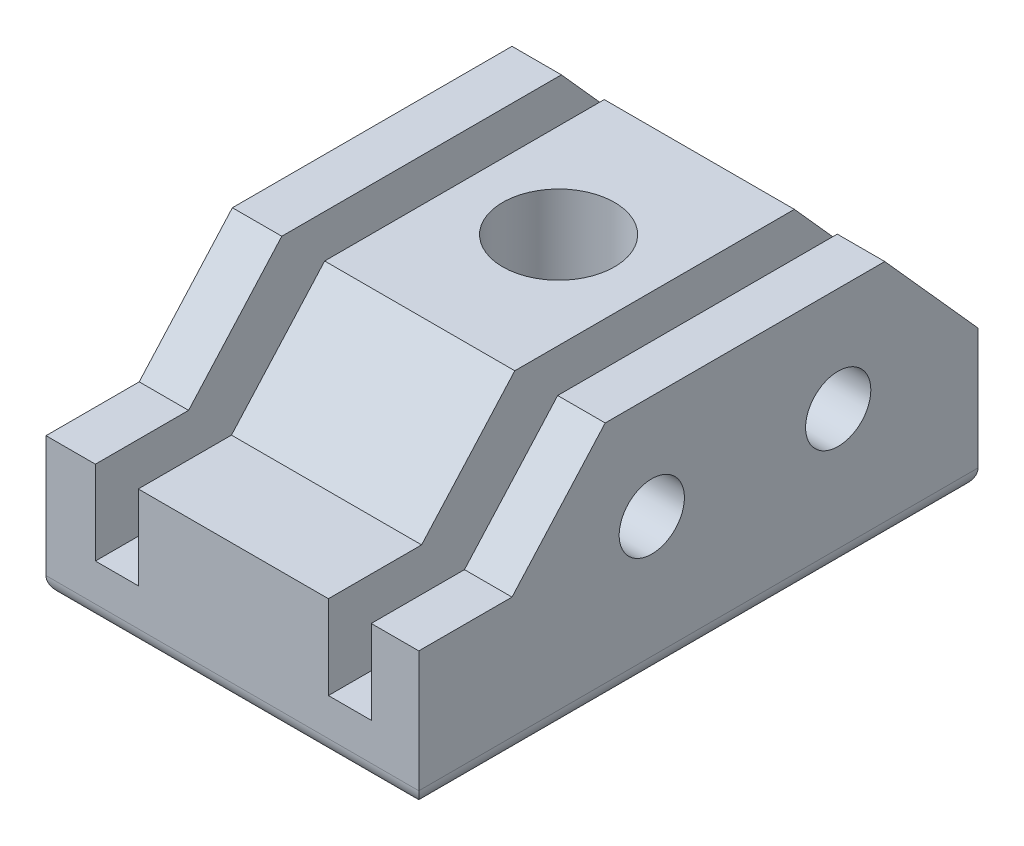
ISO-10303-21;
HEADER;
FILE_DESCRIPTION(('STEP AP214'),'2;1');
FILE_NAME('part.step','',(''),(''),'','','');
FILE_SCHEMA(('AUTOMOTIVE_DESIGN { 1 0 10303 214 1 1 1 1 }'));
ENDSEC;
DATA;
#1=APPLICATION_CONTEXT('core data for automotive mechanical design processes');
#2=APPLICATION_PROTOCOL_DEFINITION('international standard','automotive_design',2000,#1);
#3=PRODUCT_CONTEXT('',#1,'mechanical');
#4=PRODUCT('Part','Part','',(#3));
#5=PRODUCT_RELATED_PRODUCT_CATEGORY('part','',(#4));
#6=PRODUCT_DEFINITION_FORMATION('','',#4);
#7=PRODUCT_DEFINITION_CONTEXT('part definition',#1,'design');
#8=PRODUCT_DEFINITION('design','',#6,#7);
#9=PRODUCT_DEFINITION_SHAPE('','',#8);
#10=(LENGTH_UNIT() NAMED_UNIT(*) SI_UNIT(.MILLI.,.METRE.));
#11=(NAMED_UNIT(*) PLANE_ANGLE_UNIT() SI_UNIT($,.RADIAN.));
#12=(NAMED_UNIT(*) SI_UNIT($,.STERADIAN.) SOLID_ANGLE_UNIT());
#13=UNCERTAINTY_MEASURE_WITH_UNIT(LENGTH_MEASURE(1.E-05),#10,'distance_accuracy_value','');
#14=(GEOMETRIC_REPRESENTATION_CONTEXT(3) GLOBAL_UNCERTAINTY_ASSIGNED_CONTEXT((#13)) GLOBAL_UNIT_ASSIGNED_CONTEXT((#10,
#11,#12)) REPRESENTATION_CONTEXT('',''));
#15=CARTESIAN_POINT('',(0.,0.,0.));
#16=DIRECTION('',(0.,0.,1.));
#17=DIRECTION('',(1.,0.,0.));
#18=AXIS2_PLACEMENT_3D('',#15,#16,#17);
#19=CARTESIAN_POINT('',(-50.8,19.05,0.));
#20=DIRECTION('',(0.,0.666666666666667,0.74535599249993));
#21=DIRECTION('',(0.,-0.74535599249993,0.666666666666667));
#22=AXIS2_PLACEMENT_3D('',#19,#20,#21);
#23=PLANE('',#22);
#24=DIRECTION('',(0.,-0.74535599249993,0.666666666666667));
#25=VECTOR('',#24,1.);
#26=CARTESIAN_POINT('',(-44.069,19.05,0.));
#27=LINE('',#26,#25);
#28=CARTESIAN_POINT('',(-44.069,33.2490316571237,-12.7));
#29=VERTEX_POINT('',#28);
#30=CARTESIAN_POINT('',(-44.069,19.05,0.));
#31=VERTEX_POINT('',#30);
#32=EDGE_CURVE('E359',#29,#31,#27,.T.);
#33=ORIENTED_EDGE('',*,*,#32,.F.);
#34=DIRECTION('',(1.,0.,0.));
#35=VECTOR('',#34,1.);
#36=CARTESIAN_POINT('',(-50.8,33.2490316571237,-12.7));
#37=LINE('',#36,#35);
#38=CARTESIAN_POINT('',(-50.8,33.2490316571237,-12.7));
#39=VERTEX_POINT('',#38);
#40=EDGE_CURVE('E422',#39,#29,#37,.T.);
#41=ORIENTED_EDGE('',*,*,#40,.F.);
#42=DIRECTION('',(0.,-0.74535599249993,0.666666666666667));
#43=VECTOR('',#42,1.);
#44=CARTESIAN_POINT('',(-50.8,19.05,0.));
#45=LINE('',#44,#43);
#46=CARTESIAN_POINT('',(-50.8,19.05,0.));
#47=VERTEX_POINT('',#46);
#48=EDGE_CURVE('E403',#39,#47,#45,.T.);
#49=ORIENTED_EDGE('',*,*,#48,.T.);
#50=DIRECTION('',(1.,0.,0.));
#51=VECTOR('',#50,1.);
#52=CARTESIAN_POINT('',(-50.8,19.05,0.));
#53=LINE('',#52,#51);
#54=EDGE_CURVE('E415',#47,#31,#53,.T.);
#55=ORIENTED_EDGE('',*,*,#54,.T.);
#56=EDGE_LOOP('',(#33,#41,#49,#55));
#57=FACE_BOUND('',#56,.T.);
#58=ADVANCED_FACE('F53',(#57),#23,.T.);
#59=CARTESIAN_POINT('',(-50.8,33.2490316571237,-12.7));
#60=DIRECTION('',(0.,1.,0.));
#61=DIRECTION('',(0.,0.,1.));
#62=AXIS2_PLACEMENT_3D('',#59,#60,#61);
#63=PLANE('',#62);
#64=DIRECTION('',(0.,0.,-1.));
#65=VECTOR('',#64,1.);
#66=CARTESIAN_POINT('',(-44.069,33.2490316571237,0.));
#67=LINE('',#66,#65);
#68=CARTESIAN_POINT('',(-44.069,33.2490316571237,-50.8));
#69=VERTEX_POINT('',#68);
#70=EDGE_CURVE('E336',#29,#69,#67,.T.);
#71=ORIENTED_EDGE('',*,*,#70,.T.);
#72=DIRECTION('',(1.,0.,0.));
#73=VECTOR('',#72,1.);
#74=CARTESIAN_POINT('',(-50.8,33.2490316571237,-50.8));
#75=LINE('',#74,#73);
#76=CARTESIAN_POINT('',(-50.8,33.2490316571237,-50.8));
#77=VERTEX_POINT('',#76);
#78=EDGE_CURVE('E428',#77,#69,#75,.T.);
#79=ORIENTED_EDGE('',*,*,#78,.F.);
#80=DIRECTION('',(0.,0.,1.));
#81=VECTOR('',#80,1.);
#82=CARTESIAN_POINT('',(-50.8,33.2490316571237,-12.7));
#83=LINE('',#82,#81);
#84=EDGE_CURVE('E399',#77,#39,#83,.T.);
#85=ORIENTED_EDGE('',*,*,#84,.T.);
#86=ORIENTED_EDGE('',*,*,#40,.T.);
#87=EDGE_LOOP('',(#71,#79,#85,#86));
#88=FACE_BOUND('',#87,.T.);
#89=ADVANCED_FACE('F574',(#88),#63,.T.);
#90=CARTESIAN_POINT('',(-50.8,33.2490316571237,-50.8));
#91=DIRECTION('',(0.,0.666666666666666,-0.74535599249993));
#92=DIRECTION('',(0.,0.74535599249993,0.666666666666666));
#93=AXIS2_PLACEMENT_3D('',#90,#91,#92);
#94=PLANE('',#93);
#95=DIRECTION('',(0.,0.74535599249993,0.666666666666666));
#96=VECTOR('',#95,1.);
#97=CARTESIAN_POINT('',(-44.069,33.2490316571237,-50.8));
#98=LINE('',#97,#96);
#99=CARTESIAN_POINT('',(-44.069,19.05,-63.5));
#100=VERTEX_POINT('',#99);
#101=EDGE_CURVE('E356',#100,#69,#98,.T.);
#102=ORIENTED_EDGE('',*,*,#101,.F.);
#103=DIRECTION('',(1.,0.,0.));
#104=VECTOR('',#103,1.);
#105=CARTESIAN_POINT('',(-50.8,19.05,-63.5));
#106=LINE('',#105,#104);
#107=CARTESIAN_POINT('',(-50.8,19.05,-63.5));
#108=VERTEX_POINT('',#107);
#109=EDGE_CURVE('E434',#108,#100,#106,.T.);
#110=ORIENTED_EDGE('',*,*,#109,.F.);
#111=DIRECTION('',(0.,0.74535599249993,0.666666666666666));
#112=VECTOR('',#111,1.);
#113=CARTESIAN_POINT('',(-50.8,33.2490316571237,-50.8));
#114=LINE('',#113,#112);
#115=EDGE_CURVE('E395',#108,#77,#114,.T.);
#116=ORIENTED_EDGE('',*,*,#115,.T.);
#117=ORIENTED_EDGE('',*,*,#78,.T.);
#118=EDGE_LOOP('',(#102,#110,#116,#117));
#119=FACE_BOUND('',#118,.T.);
#120=ADVANCED_FACE('F582',(#119),#94,.T.);
#121=DIRECTION('',(0.,0.74535599249993,-0.666666666666667));
#122=VECTOR('',#121,1.);
#123=CARTESIAN_POINT('',(-38.227,19.05,0.));
#124=LINE('',#123,#122);
#125=CARTESIAN_POINT('',(-38.227,19.05,0.));
#126=VERTEX_POINT('',#125);
#127=CARTESIAN_POINT('',(-38.227,33.2490316571237,-12.7));
#128=VERTEX_POINT('',#127);
#129=EDGE_CURVE('E353',#126,#128,#124,.T.);
#130=ORIENTED_EDGE('',*,*,#129,.F.);
#131=CARTESIAN_POINT('',(-12.319,19.05,0.));
#132=VERTEX_POINT('',#131);
#133=EDGE_CURVE('E420',#126,#132,#53,.T.);
#134=ORIENTED_EDGE('',*,*,#133,.T.);
#135=DIRECTION('',(0.,-0.74535599249993,0.666666666666667));
#136=VECTOR('',#135,1.);
#137=CARTESIAN_POINT('',(-12.319,19.05,0.));
#138=LINE('',#137,#136);
#139=CARTESIAN_POINT('',(-12.319,33.2490316571237,-12.7));
#140=VERTEX_POINT('',#139);
#141=EDGE_CURVE('E390',#140,#132,#138,.T.);
#142=ORIENTED_EDGE('',*,*,#141,.F.);
#143=EDGE_CURVE('E426',#128,#140,#37,.T.);
#144=ORIENTED_EDGE('',*,*,#143,.F.);
#145=EDGE_LOOP('',(#130,#134,#142,#144));
#146=FACE_BOUND('',#145,.T.);
#147=ADVANCED_FACE('F577',(#146),#23,.T.);
#148=CARTESIAN_POINT('',(-25.4,33.2490316571237,-31.75));
#149=DIRECTION('',(0.,1.,0.));
#150=DIRECTION('',(0.,0.,1.));
#151=AXIS2_PLACEMENT_3D('',#148,#149,#150);
#152=CIRCLE('',#151,7.62);
#153=CARTESIAN_POINT('',(-25.4,33.2490316571237,-24.13));
#154=VERTEX_POINT('',#153);
#155=EDGE_CURVE('E495',#154,#154,#152,.T.);
#156=ORIENTED_EDGE('',*,*,#155,.F.);
#157=EDGE_LOOP('',(#156));
#158=FACE_BOUND('',#157,.T.);
#159=DIRECTION('',(0.,0.,-1.));
#160=VECTOR('',#159,1.);
#161=CARTESIAN_POINT('',(-38.227,33.2490316571237,0.));
#162=LINE('',#161,#160);
#163=CARTESIAN_POINT('',(-38.227,33.2490316571237,-50.8));
#164=VERTEX_POINT('',#163);
#165=EDGE_CURVE('E345',#128,#164,#162,.T.);
#166=ORIENTED_EDGE('',*,*,#165,.F.);
#167=ORIENTED_EDGE('',*,*,#143,.T.);
#168=DIRECTION('',(0.,0.,-1.));
#169=VECTOR('',#168,1.);
#170=CARTESIAN_POINT('',(-12.319,33.2490316571237,0.));
#171=LINE('',#170,#169);
#172=CARTESIAN_POINT('',(-12.319,33.2490316571237,-50.8));
#173=VERTEX_POINT('',#172);
#174=EDGE_CURVE('E373',#140,#173,#171,.T.);
#175=ORIENTED_EDGE('',*,*,#174,.T.);
#176=EDGE_CURVE('E432',#164,#173,#75,.T.);
#177=ORIENTED_EDGE('',*,*,#176,.F.);
#178=EDGE_LOOP('',(#166,#167,#175,#177));
#179=FACE_BOUND('',#178,.T.);
#180=ADVANCED_FACE('F585',(#158,#179),#63,.T.);
#181=DIRECTION('',(0.,-0.74535599249993,-0.666666666666666));
#182=VECTOR('',#181,1.);
#183=CARTESIAN_POINT('',(-38.227,33.2490316571237,-50.8));
#184=LINE('',#183,#182);
#185=CARTESIAN_POINT('',(-38.227,19.05,-63.5));
#186=VERTEX_POINT('',#185);
#187=EDGE_CURVE('E340',#164,#186,#184,.T.);
#188=ORIENTED_EDGE('',*,*,#187,.F.);
#189=ORIENTED_EDGE('',*,*,#176,.T.);
#190=DIRECTION('',(0.,0.74535599249993,0.666666666666666));
#191=VECTOR('',#190,1.);
#192=CARTESIAN_POINT('',(-12.319,33.2490316571237,-50.8));
#193=LINE('',#192,#191);
#194=CARTESIAN_POINT('',(-12.319,19.05,-63.5));
#195=VERTEX_POINT('',#194);
#196=EDGE_CURVE('E447',#195,#173,#193,.T.);
#197=ORIENTED_EDGE('',*,*,#196,.F.);
#198=EDGE_CURVE('E438',#186,#195,#106,.T.);
#199=ORIENTED_EDGE('',*,*,#198,.F.);
#200=EDGE_LOOP('',(#188,#189,#197,#199));
#201=FACE_BOUND('',#200,.T.);
#202=ADVANCED_FACE('F668',(#201),#94,.T.);
#203=CARTESIAN_POINT('',(-50.8,0.,-63.5));
#204=DIRECTION('',(0.,0.,-1.));
#205=DIRECTION('',(-1.,0.,0.));
#206=AXIS2_PLACEMENT_3D('',#203,#204,#205);
#207=PLANE('',#206);
#208=DIRECTION('',(0.,1.,0.));
#209=VECTOR('',#208,1.);
#210=CARTESIAN_POINT('',(0.,0.,-63.5));
#211=LINE('',#210,#209);
#212=CARTESIAN_POINT('',(0.,2.54,-63.5));
#213=VERTEX_POINT('',#212);
#214=CARTESIAN_POINT('',(0.,19.05,-63.5));
#215=VERTEX_POINT('',#214);
#216=EDGE_CURVE('E419',#213,#215,#211,.T.);
#217=ORIENTED_EDGE('',*,*,#216,.F.);
#218=DIRECTION('',(1.,0.,0.));
#219=VECTOR('',#218,1.);
#220=CARTESIAN_POINT('',(-50.8,2.54,-63.5));
#221=LINE('',#220,#219);
#222=CARTESIAN_POINT('',(-50.8,2.54,-63.5));
#223=VERTEX_POINT('',#222);
#224=EDGE_CURVE('E473',#213,#223,#221,.F.);
#225=ORIENTED_EDGE('',*,*,#224,.T.);
#226=DIRECTION('',(0.,1.,0.));
#227=VECTOR('',#226,1.);
#228=CARTESIAN_POINT('',(-50.8,0.,-63.5));
#229=LINE('',#228,#227);
#230=EDGE_CURVE('E439',#223,#108,#229,.T.);
#231=ORIENTED_EDGE('',*,*,#230,.T.);
#232=ORIENTED_EDGE('',*,*,#109,.T.);
#233=DIRECTION('',(0.,1.,0.));
#234=VECTOR('',#233,1.);
#235=CARTESIAN_POINT('',(-44.069,7.61999999999999,-63.5));
#236=LINE('',#235,#234);
#237=CARTESIAN_POINT('',(-44.069,7.61999999999999,-63.5));
#238=VERTEX_POINT('',#237);
#239=EDGE_CURVE('E329',#238,#100,#236,.T.);
#240=ORIENTED_EDGE('',*,*,#239,.F.);
#241=DIRECTION('',(-1.,0.,0.));
#242=VECTOR('',#241,1.);
#243=CARTESIAN_POINT('',(-38.227,7.61999999999999,-63.5));
#244=LINE('',#243,#242);
#245=CARTESIAN_POINT('',(-38.227,7.61999999999999,-63.5));
#246=VERTEX_POINT('',#245);
#247=EDGE_CURVE('E332',#246,#238,#244,.T.);
#248=ORIENTED_EDGE('',*,*,#247,.F.);
#249=DIRECTION('',(0.,-1.,0.));
#250=VECTOR('',#249,1.);
#251=CARTESIAN_POINT('',(-38.227,0.,-63.5));
#252=LINE('',#251,#250);
#253=EDGE_CURVE('E451',#186,#246,#252,.T.);
#254=ORIENTED_EDGE('',*,*,#253,.F.);
#255=ORIENTED_EDGE('',*,*,#198,.T.);
#256=DIRECTION('',(0.,1.,0.));
#257=VECTOR('',#256,1.);
#258=CARTESIAN_POINT('',(-12.319,7.61999999999999,-63.5));
#259=LINE('',#258,#257);
#260=CARTESIAN_POINT('',(-12.319,7.61999999999999,-63.5));
#261=VERTEX_POINT('',#260);
#262=EDGE_CURVE('E362',#261,#195,#259,.T.);
#263=ORIENTED_EDGE('',*,*,#262,.F.);
#264=DIRECTION('',(-1.,0.,0.));
#265=VECTOR('',#264,1.);
#266=CARTESIAN_POINT('',(-6.477,7.61999999999999,-63.5));
#267=LINE('',#266,#265);
#268=CARTESIAN_POINT('',(-6.477,7.61999999999999,-63.5));
#269=VERTEX_POINT('',#268);
#270=EDGE_CURVE('E369',#269,#261,#267,.T.);
#271=ORIENTED_EDGE('',*,*,#270,.F.);
#272=DIRECTION('',(0.,-1.,0.));
#273=VECTOR('',#272,1.);
#274=CARTESIAN_POINT('',(-6.477,7.61999999999999,-63.5));
#275=LINE('',#274,#273);
#276=CARTESIAN_POINT('',(-6.477,19.05,-63.5));
#277=VERTEX_POINT('',#276);
#278=EDGE_CURVE('E366',#277,#269,#275,.T.);
#279=ORIENTED_EDGE('',*,*,#278,.F.);
#280=EDGE_CURVE('E406',#277,#215,#106,.T.);
#281=ORIENTED_EDGE('',*,*,#280,.T.);
#282=EDGE_LOOP('',(#217,#225,#231,#232,#240,#248,#254,#255,#263,#271,#279,#281));
#283=FACE_BOUND('',#282,.T.);
#284=ADVANCED_FACE('F552',(#283),#207,.T.);
#285=CARTESIAN_POINT('',(-50.8,0.,0.));
#286=DIRECTION('',(0.,-1.,0.));
#287=DIRECTION('',(0.,0.,-1.));
#288=AXIS2_PLACEMENT_3D('',#285,#286,#287);
#289=PLANE('',#288);
#290=CARTESIAN_POINT('',(-30.4,0.,3.34999999999999));
#291=DIRECTION('',(0.,-1.,0.));
#292=DIRECTION('',(0.,0.,-1.));
#293=AXIS2_PLACEMENT_3D('',#290,#291,#292);
#294=CIRCLE('',#293,3.175);
#295=CARTESIAN_POINT('',(-30.4,0.,0.174999999999991));
#296=VERTEX_POINT('',#295);
#297=EDGE_CURVE('E515',#296,#296,#294,.T.);
#298=ORIENTED_EDGE('',*,*,#297,.F.);
#299=EDGE_LOOP('',(#298));
#300=FACE_BOUND('',#299,.T.);
#301=CARTESIAN_POINT('',(-20.4,0.,3.34999999999999));
#302=DIRECTION('',(0.,-1.,0.));
#303=DIRECTION('',(0.,0.,-1.));
#304=AXIS2_PLACEMENT_3D('',#301,#302,#303);
#305=CIRCLE('',#304,3.175);
#306=CARTESIAN_POINT('',(-20.4,0.,0.174999999999991));
#307=VERTEX_POINT('',#306);
#308=EDGE_CURVE('E523',#307,#307,#305,.T.);
#309=ORIENTED_EDGE('',*,*,#308,.F.);
#310=EDGE_LOOP('',(#309));
#311=FACE_BOUND('',#310,.T.);
#312=CARTESIAN_POINT('',(-20.4,0.,-46.15));
#313=DIRECTION('',(0.,-1.,0.));
#314=DIRECTION('',(0.,0.,-1.));
#315=AXIS2_PLACEMENT_3D('',#312,#313,#314);
#316=CIRCLE('',#315,3.175);
#317=CARTESIAN_POINT('',(-20.4,0.,-49.325));
#318=VERTEX_POINT('',#317);
#319=EDGE_CURVE('E531',#318,#318,#316,.T.);
#320=ORIENTED_EDGE('',*,*,#319,.F.);
#321=EDGE_LOOP('',(#320));
#322=FACE_BOUND('',#321,.T.);
#323=CARTESIAN_POINT('',(-30.4,0.,-46.15));
#324=DIRECTION('',(0.,-1.,0.));
#325=DIRECTION('',(0.,0.,-1.));
#326=AXIS2_PLACEMENT_3D('',#323,#324,#325);
#327=CIRCLE('',#326,3.175);
#328=CARTESIAN_POINT('',(-30.4,0.,-49.325));
#329=VERTEX_POINT('',#328);
#330=EDGE_CURVE('E507',#329,#329,#327,.T.);
#331=ORIENTED_EDGE('',*,*,#330,.F.);
#332=EDGE_LOOP('',(#331));
#333=FACE_BOUND('',#332,.T.);
#334=DIRECTION('',(0.,0.,-1.));
#335=VECTOR('',#334,1.);
#336=CARTESIAN_POINT('',(-48.26,0.,0.));
#337=LINE('',#336,#335);
#338=CARTESIAN_POINT('',(-48.26,0.,10.16));
#339=VERTEX_POINT('',#338);
#340=CARTESIAN_POINT('',(-48.26,0.,-60.96));
#341=VERTEX_POINT('',#340);
#342=EDGE_CURVE('E466',#339,#341,#337,.T.);
#343=ORIENTED_EDGE('',*,*,#342,.T.);
#344=DIRECTION('',(1.,0.,0.));
#345=VECTOR('',#344,1.);
#346=CARTESIAN_POINT('',(-50.8,0.,-60.96));
#347=LINE('',#346,#345);
#348=CARTESIAN_POINT('',(-2.54,0.,-60.96));
#349=VERTEX_POINT('',#348);
#350=EDGE_CURVE('E469',#341,#349,#347,.T.);
#351=ORIENTED_EDGE('',*,*,#350,.T.);
#352=DIRECTION('',(0.,0.,-1.));
#353=VECTOR('',#352,1.);
#354=CARTESIAN_POINT('',(-2.54,0.,12.7));
#355=LINE('',#354,#353);
#356=CARTESIAN_POINT('',(-2.54,0.,10.16));
#357=VERTEX_POINT('',#356);
#358=EDGE_CURVE('E454',#349,#357,#355,.F.);
#359=ORIENTED_EDGE('',*,*,#358,.T.);
#360=DIRECTION('',(1.,0.,0.));
#361=VECTOR('',#360,1.);
#362=CARTESIAN_POINT('',(-50.8,0.,10.16));
#363=LINE('',#362,#361);
#364=EDGE_CURVE('E463',#357,#339,#363,.F.);
#365=ORIENTED_EDGE('',*,*,#364,.T.);
#366=EDGE_LOOP('',(#343,#351,#359,#365));
#367=FACE_BOUND('',#366,.T.);
#368=CARTESIAN_POINT('',(-25.4,0.,-31.75));
#369=DIRECTION('',(0.,1.,0.));
#370=DIRECTION('',(0.,0.,1.));
#371=AXIS2_PLACEMENT_3D('',#368,#369,#370);
#372=CIRCLE('',#371,7.62);
#373=CARTESIAN_POINT('',(-25.4,0.,-24.13));
#374=VERTEX_POINT('',#373);
#375=EDGE_CURVE('E218',#374,#374,#372,.T.);
#376=ORIENTED_EDGE('',*,*,#375,.T.);
#377=EDGE_LOOP('',(#376));
#378=FACE_BOUND('',#377,.T.);
#379=ADVANCED_FACE('F548',(#300,#311,#322,#333,#367,#378),#289,.T.);
#380=CARTESIAN_POINT('',(-50.8,0.,0.));
#381=DIRECTION('',(-1.,0.,0.));
#382=DIRECTION('',(0.,0.,1.));
#383=AXIS2_PLACEMENT_3D('',#380,#381,#382);
#384=PLANE('',#383);
#385=CARTESIAN_POINT('',(-50.8,19.05,-19.05));
#386=DIRECTION('',(1.,0.,0.));
#387=DIRECTION('',(0.,0.,-1.));
#388=AXIS2_PLACEMENT_3D('',#385,#386,#387);
#389=CIRCLE('',#388,4.445);
#390=CARTESIAN_POINT('',(-50.8,19.05,-23.495));
#391=VERTEX_POINT('',#390);
#392=EDGE_CURVE('E288',#391,#391,#389,.T.);
#393=ORIENTED_EDGE('',*,*,#392,.T.);
#394=EDGE_LOOP('',(#393));
#395=FACE_BOUND('',#394,.T.);
#396=CARTESIAN_POINT('',(-50.8,19.05,-44.45));
#397=DIRECTION('',(1.,0.,0.));
#398=DIRECTION('',(0.,0.,-1.));
#399=AXIS2_PLACEMENT_3D('',#396,#397,#398);
#400=CIRCLE('',#399,4.44499999999999);
#401=CARTESIAN_POINT('',(-50.8,19.05,-48.895));
#402=VERTEX_POINT('',#401);
#403=EDGE_CURVE('E297',#402,#402,#400,.T.);
#404=ORIENTED_EDGE('',*,*,#403,.T.);
#405=EDGE_LOOP('',(#404));
#406=FACE_BOUND('',#405,.T.);
#407=ORIENTED_EDGE('',*,*,#230,.F.);
#408=DIRECTION('',(0.,0.,-1.));
#409=VECTOR('',#408,1.);
#410=CARTESIAN_POINT('',(-50.8,2.54,0.));
#411=LINE('',#410,#409);
#412=CARTESIAN_POINT('',(-50.8,2.54,12.7));
#413=VERTEX_POINT('',#412);
#414=EDGE_CURVE('E78',#223,#413,#411,.F.);
#415=ORIENTED_EDGE('',*,*,#414,.T.);
#416=DIRECTION('',(0.,-1.,0.));
#417=VECTOR('',#416,1.);
#418=CARTESIAN_POINT('',(-50.8,7.61999999999999,12.7));
#419=LINE('',#418,#417);
#420=CARTESIAN_POINT('',(-50.8,19.05,12.7));
#421=VERTEX_POINT('',#420);
#422=EDGE_CURVE('E267',#421,#413,#419,.T.);
#423=ORIENTED_EDGE('',*,*,#422,.F.);
#424=DIRECTION('',(0.,0.,-1.));
#425=VECTOR('',#424,1.);
#426=CARTESIAN_POINT('',(-50.8,19.05,12.7));
#427=LINE('',#426,#425);
#428=EDGE_CURVE('E270',#421,#47,#427,.T.);
#429=ORIENTED_EDGE('',*,*,#428,.T.);
#430=ORIENTED_EDGE('',*,*,#48,.F.);
#431=ORIENTED_EDGE('',*,*,#84,.F.);
#432=ORIENTED_EDGE('',*,*,#115,.F.);
#433=EDGE_LOOP('',(#407,#415,#423,#429,#430,#431,#432));
#434=FACE_BOUND('',#433,.T.);
#435=ADVANCED_FACE('F551',(#395,#406,#434),#384,.T.);
#436=CARTESIAN_POINT('',(0.,0.,0.));
#437=DIRECTION('',(-1.,0.,0.));
#438=DIRECTION('',(0.,0.,1.));
#439=AXIS2_PLACEMENT_3D('',#436,#437,#438);
#440=PLANE('',#439);
#441=CARTESIAN_POINT('',(0.,19.05,-19.05));
#442=DIRECTION('',(1.,0.,0.));
#443=DIRECTION('',(0.,0.,-1.));
#444=AXIS2_PLACEMENT_3D('',#441,#442,#443);
#445=CIRCLE('',#444,4.445);
#446=CARTESIAN_POINT('',(0.,19.05,-23.495));
#447=VERTEX_POINT('',#446);
#448=EDGE_CURVE('E293',#447,#447,#445,.T.);
#449=ORIENTED_EDGE('',*,*,#448,.F.);
#450=EDGE_LOOP('',(#449));
#451=FACE_BOUND('',#450,.T.);
#452=CARTESIAN_POINT('',(0.,19.05,-44.45));
#453=DIRECTION('',(1.,0.,0.));
#454=DIRECTION('',(0.,0.,-1.));
#455=AXIS2_PLACEMENT_3D('',#452,#453,#454);
#456=CIRCLE('',#455,4.44499999999999);
#457=CARTESIAN_POINT('',(0.,19.05,-48.895));
#458=VERTEX_POINT('',#457);
#459=EDGE_CURVE('E230',#458,#458,#456,.T.);
#460=ORIENTED_EDGE('',*,*,#459,.F.);
#461=EDGE_LOOP('',(#460));
#462=FACE_BOUND('',#461,.T.);
#463=DIRECTION('',(0.,1.,0.));
#464=VECTOR('',#463,1.);
#465=CARTESIAN_POINT('',(0.,0.,12.7));
#466=LINE('',#465,#464);
#467=CARTESIAN_POINT('',(0.,2.54,12.7));
#468=VERTEX_POINT('',#467);
#469=CARTESIAN_POINT('',(0.,19.05,12.7));
#470=VERTEX_POINT('',#469);
#471=EDGE_CURVE('E208',#468,#470,#466,.T.);
#472=ORIENTED_EDGE('',*,*,#471,.F.);
#473=DIRECTION('',(0.,0.,-1.));
#474=VECTOR('',#473,1.);
#475=CARTESIAN_POINT('',(0.,2.54,-63.5));
#476=LINE('',#475,#474);
#477=EDGE_CURVE('E13',#468,#213,#476,.T.);
#478=ORIENTED_EDGE('',*,*,#477,.T.);
#479=ORIENTED_EDGE('',*,*,#216,.T.);
#480=DIRECTION('',(0.,0.74535599249993,0.666666666666666));
#481=VECTOR('',#480,1.);
#482=CARTESIAN_POINT('',(0.,33.2490316571237,-50.8));
#483=LINE('',#482,#481);
#484=CARTESIAN_POINT('',(0.,33.2490316571237,-50.8));
#485=VERTEX_POINT('',#484);
#486=EDGE_CURVE('E394',#215,#485,#483,.T.);
#487=ORIENTED_EDGE('',*,*,#486,.T.);
#488=DIRECTION('',(0.,0.,1.));
#489=VECTOR('',#488,1.);
#490=CARTESIAN_POINT('',(0.,33.2490316571237,-12.7));
#491=LINE('',#490,#489);
#492=CARTESIAN_POINT('',(0.,33.2490316571237,-12.7));
#493=VERTEX_POINT('',#492);
#494=EDGE_CURVE('E410',#485,#493,#491,.T.);
#495=ORIENTED_EDGE('',*,*,#494,.T.);
#496=DIRECTION('',(0.,-0.74535599249993,0.666666666666667));
#497=VECTOR('',#496,1.);
#498=CARTESIAN_POINT('',(0.,19.05,0.));
#499=LINE('',#498,#497);
#500=CARTESIAN_POINT('',(0.,19.05,0.));
#501=VERTEX_POINT('',#500);
#502=EDGE_CURVE('E226',#493,#501,#499,.T.);
#503=ORIENTED_EDGE('',*,*,#502,.T.);
#504=DIRECTION('',(0.,0.,-1.));
#505=VECTOR('',#504,1.);
#506=CARTESIAN_POINT('',(0.,19.05,12.7));
#507=LINE('',#506,#505);
#508=EDGE_CURVE('E222',#470,#501,#507,.T.);
#509=ORIENTED_EDGE('',*,*,#508,.F.);
#510=EDGE_LOOP('',(#472,#478,#479,#487,#495,#503,#509));
#511=FACE_BOUND('',#510,.T.);
#512=ADVANCED_FACE('F223',(#451,#462,#511),#440,.F.);
#513=DIRECTION('',(0.,0.74535599249993,-0.666666666666667));
#514=VECTOR('',#513,1.);
#515=CARTESIAN_POINT('',(-6.477,19.05,0.));
#516=LINE('',#515,#514);
#517=CARTESIAN_POINT('',(-6.477,19.05,0.));
#518=VERTEX_POINT('',#517);
#519=CARTESIAN_POINT('',(-6.477,33.2490316571237,-12.7));
#520=VERTEX_POINT('',#519);
#521=EDGE_CURVE('E377',#518,#520,#516,.T.);
#522=ORIENTED_EDGE('',*,*,#521,.F.);
#523=EDGE_CURVE('E421',#518,#501,#53,.T.);
#524=ORIENTED_EDGE('',*,*,#523,.T.);
#525=ORIENTED_EDGE('',*,*,#502,.F.);
#526=EDGE_CURVE('E427',#520,#493,#37,.T.);
#527=ORIENTED_EDGE('',*,*,#526,.F.);
#528=EDGE_LOOP('',(#522,#524,#525,#527));
#529=FACE_BOUND('',#528,.T.);
#530=ADVANCED_FACE('F578',(#529),#23,.T.);
#531=DIRECTION('',(0.,0.,-1.));
#532=VECTOR('',#531,1.);
#533=CARTESIAN_POINT('',(-6.477,33.2490316571237,0.));
#534=LINE('',#533,#532);
#535=CARTESIAN_POINT('',(-6.477,33.2490316571237,-50.8));
#536=VERTEX_POINT('',#535);
#537=EDGE_CURVE('E382',#520,#536,#534,.T.);
#538=ORIENTED_EDGE('',*,*,#537,.F.);
#539=ORIENTED_EDGE('',*,*,#526,.T.);
#540=ORIENTED_EDGE('',*,*,#494,.F.);
#541=EDGE_CURVE('E433',#536,#485,#75,.T.);
#542=ORIENTED_EDGE('',*,*,#541,.F.);
#543=EDGE_LOOP('',(#538,#539,#540,#542));
#544=FACE_BOUND('',#543,.T.);
#545=ADVANCED_FACE('F586',(#544),#63,.T.);
#546=DIRECTION('',(0.,-0.74535599249993,-0.666666666666666));
#547=VECTOR('',#546,1.);
#548=CARTESIAN_POINT('',(-6.477,33.2490316571237,-50.8));
#549=LINE('',#548,#547);
#550=EDGE_CURVE('E442',#536,#277,#549,.T.);
#551=ORIENTED_EDGE('',*,*,#550,.F.);
#552=ORIENTED_EDGE('',*,*,#541,.T.);
#553=ORIENTED_EDGE('',*,*,#486,.F.);
#554=ORIENTED_EDGE('',*,*,#280,.F.);
#555=EDGE_LOOP('',(#551,#552,#553,#554));
#556=FACE_BOUND('',#555,.T.);
#557=ADVANCED_FACE('F597',(#556),#94,.T.);
#558=CARTESIAN_POINT('',(-12.319,7.61999999999999,0.));
#559=DIRECTION('',(-1.,0.,0.));
#560=DIRECTION('',(0.,0.,1.));
#561=AXIS2_PLACEMENT_3D('',#558,#559,#560);
#562=PLANE('',#561);
#563=CARTESIAN_POINT('',(-12.319,19.05,-19.05));
#564=DIRECTION('',(-1.,0.,0.));
#565=DIRECTION('',(0.,0.,1.));
#566=AXIS2_PLACEMENT_3D('',#563,#564,#565);
#567=CIRCLE('',#566,4.445);
#568=CARTESIAN_POINT('',(-12.319,19.05,-14.605));
#569=VERTEX_POINT('',#568);
#570=EDGE_CURVE('E325',#569,#569,#567,.T.);
#571=ORIENTED_EDGE('',*,*,#570,.T.);
#572=EDGE_LOOP('',(#571));
#573=FACE_BOUND('',#572,.T.);
#574=CARTESIAN_POINT('',(-12.319,19.05,-44.45));
#575=DIRECTION('',(-1.,0.,0.));
#576=DIRECTION('',(0.,0.,1.));
#577=AXIS2_PLACEMENT_3D('',#574,#575,#576);
#578=CIRCLE('',#577,4.44499999999999);
#579=CARTESIAN_POINT('',(-12.319,19.05,-40.005));
#580=VERTEX_POINT('',#579);
#581=EDGE_CURVE('E312',#580,#580,#578,.T.);
#582=ORIENTED_EDGE('',*,*,#581,.T.);
#583=EDGE_LOOP('',(#582));
#584=FACE_BOUND('',#583,.T.);
#585=ORIENTED_EDGE('',*,*,#141,.T.);
#586=DIRECTION('',(0.,0.,-1.));
#587=VECTOR('',#586,1.);
#588=CARTESIAN_POINT('',(-12.319,19.05,12.7));
#589=LINE('',#588,#587);
#590=CARTESIAN_POINT('',(-12.319,19.05,12.7));
#591=VERTEX_POINT('',#590);
#592=EDGE_CURVE('E282',#591,#132,#589,.T.);
#593=ORIENTED_EDGE('',*,*,#592,.F.);
#594=DIRECTION('',(0.,1.,0.));
#595=VECTOR('',#594,1.);
#596=CARTESIAN_POINT('',(-12.319,19.05,12.7));
#597=LINE('',#596,#595);
#598=CARTESIAN_POINT('',(-12.319,7.61999999999999,12.7));
#599=VERTEX_POINT('',#598);
#600=EDGE_CURVE('E247',#599,#591,#597,.T.);
#601=ORIENTED_EDGE('',*,*,#600,.F.);
#602=DIRECTION('',(0.,0.,-1.));
#603=VECTOR('',#602,1.);
#604=CARTESIAN_POINT('',(-12.319,7.61999999999999,0.));
#605=LINE('',#604,#603);
#606=EDGE_CURVE('E374',#599,#261,#605,.T.);
#607=ORIENTED_EDGE('',*,*,#606,.T.);
#608=ORIENTED_EDGE('',*,*,#262,.T.);
#609=ORIENTED_EDGE('',*,*,#196,.T.);
#610=ORIENTED_EDGE('',*,*,#174,.F.);
#611=EDGE_LOOP('',(#585,#593,#601,#607,#608,#609,#610));
#612=FACE_BOUND('',#611,.T.);
#613=ADVANCED_FACE('F613',(#573,#584,#612),#562,.F.);
#614=CARTESIAN_POINT('',(-6.477,7.61999999999999,0.));
#615=DIRECTION('',(0.,-1.,0.));
#616=DIRECTION('',(0.,0.,-1.));
#617=AXIS2_PLACEMENT_3D('',#614,#615,#616);
#618=PLANE('',#617);
#619=ORIENTED_EDGE('',*,*,#270,.T.);
#620=ORIENTED_EDGE('',*,*,#606,.F.);
#621=DIRECTION('',(-1.,0.,0.));
#622=VECTOR('',#621,1.);
#623=CARTESIAN_POINT('',(-6.477,7.61999999999999,12.7));
#624=LINE('',#623,#622);
#625=CARTESIAN_POINT('',(-6.477,7.61999999999999,12.7));
#626=VERTEX_POINT('',#625);
#627=EDGE_CURVE('E240',#626,#599,#624,.T.);
#628=ORIENTED_EDGE('',*,*,#627,.F.);
#629=DIRECTION('',(0.,0.,-1.));
#630=VECTOR('',#629,1.);
#631=CARTESIAN_POINT('',(-6.477,7.61999999999999,0.));
#632=LINE('',#631,#630);
#633=EDGE_CURVE('E378',#626,#269,#632,.T.);
#634=ORIENTED_EDGE('',*,*,#633,.T.);
#635=EDGE_LOOP('',(#619,#620,#628,#634));
#636=FACE_BOUND('',#635,.T.);
#637=ADVANCED_FACE('F609',(#636),#618,.F.);
#638=CARTESIAN_POINT('',(-6.477,7.61999999999999,0.));
#639=DIRECTION('',(1.,0.,0.));
#640=DIRECTION('',(0.,0.,-1.));
#641=AXIS2_PLACEMENT_3D('',#638,#639,#640);
#642=PLANE('',#641);
#643=CARTESIAN_POINT('',(-6.477,19.05,-19.05));
#644=DIRECTION('',(1.,0.,0.));
#645=DIRECTION('',(0.,0.,-1.));
#646=AXIS2_PLACEMENT_3D('',#643,#644,#645);
#647=CIRCLE('',#646,4.445);
#648=CARTESIAN_POINT('',(-6.477,19.05,-23.495));
#649=VERTEX_POINT('',#648);
#650=EDGE_CURVE('E321',#649,#649,#647,.T.);
#651=ORIENTED_EDGE('',*,*,#650,.T.);
#652=EDGE_LOOP('',(#651));
#653=FACE_BOUND('',#652,.T.);
#654=CARTESIAN_POINT('',(-6.477,19.05,-44.45));
#655=DIRECTION('',(1.,0.,0.));
#656=DIRECTION('',(0.,0.,-1.));
#657=AXIS2_PLACEMENT_3D('',#654,#655,#656);
#658=CIRCLE('',#657,4.44499999999999);
#659=CARTESIAN_POINT('',(-6.477,19.05,-48.895));
#660=VERTEX_POINT('',#659);
#661=EDGE_CURVE('E308',#660,#660,#658,.T.);
#662=ORIENTED_EDGE('',*,*,#661,.T.);
#663=EDGE_LOOP('',(#662));
#664=FACE_BOUND('',#663,.T.);
#665=ORIENTED_EDGE('',*,*,#521,.T.);
#666=ORIENTED_EDGE('',*,*,#537,.T.);
#667=ORIENTED_EDGE('',*,*,#550,.T.);
#668=ORIENTED_EDGE('',*,*,#278,.T.);
#669=ORIENTED_EDGE('',*,*,#633,.F.);
#670=DIRECTION('',(0.,-1.,0.));
#671=VECTOR('',#670,1.);
#672=CARTESIAN_POINT('',(-6.477,7.61999999999999,12.7));
#673=LINE('',#672,#671);
#674=CARTESIAN_POINT('',(-6.477,19.05,12.7));
#675=VERTEX_POINT('',#674);
#676=EDGE_CURVE('E237',#675,#626,#673,.T.);
#677=ORIENTED_EDGE('',*,*,#676,.F.);
#678=DIRECTION('',(0.,0.,-1.));
#679=VECTOR('',#678,1.);
#680=CARTESIAN_POINT('',(-6.477,19.05,12.7));
#681=LINE('',#680,#679);
#682=EDGE_CURVE('E231',#675,#518,#681,.T.);
#683=ORIENTED_EDGE('',*,*,#682,.T.);
#684=EDGE_LOOP('',(#665,#666,#667,#668,#669,#677,#683));
#685=FACE_BOUND('',#684,.T.);
#686=ADVANCED_FACE('F605',(#653,#664,#685),#642,.F.);
#687=CARTESIAN_POINT('',(-44.069,7.61999999999999,0.));
#688=DIRECTION('',(-1.,0.,0.));
#689=DIRECTION('',(0.,0.,1.));
#690=AXIS2_PLACEMENT_3D('',#687,#688,#689);
#691=PLANE('',#690);
#692=CARTESIAN_POINT('',(-44.069,19.05,-19.05));
#693=DIRECTION('',(-1.,0.,0.));
#694=DIRECTION('',(0.,0.,1.));
#695=AXIS2_PLACEMENT_3D('',#692,#693,#694);
#696=CIRCLE('',#695,4.445);
#697=CARTESIAN_POINT('',(-44.069,19.05,-14.605));
#698=VERTEX_POINT('',#697);
#699=EDGE_CURVE('E317',#698,#698,#696,.T.);
#700=ORIENTED_EDGE('',*,*,#699,.T.);
#701=EDGE_LOOP('',(#700));
#702=FACE_BOUND('',#701,.T.);
#703=CARTESIAN_POINT('',(-44.069,19.05,-44.45));
#704=DIRECTION('',(-1.,0.,0.));
#705=DIRECTION('',(0.,0.,1.));
#706=AXIS2_PLACEMENT_3D('',#703,#704,#705);
#707=CIRCLE('',#706,4.44499999999999);
#708=CARTESIAN_POINT('',(-44.069,19.05,-40.005));
#709=VERTEX_POINT('',#708);
#710=EDGE_CURVE('E304',#709,#709,#707,.T.);
#711=ORIENTED_EDGE('',*,*,#710,.T.);
#712=EDGE_LOOP('',(#711));
#713=FACE_BOUND('',#712,.T.);
#714=ORIENTED_EDGE('',*,*,#32,.T.);
#715=DIRECTION('',(0.,0.,-1.));
#716=VECTOR('',#715,1.);
#717=CARTESIAN_POINT('',(-44.069,19.05,12.7));
#718=LINE('',#717,#716);
#719=CARTESIAN_POINT('',(-44.069,19.05,12.7));
#720=VERTEX_POINT('',#719);
#721=EDGE_CURVE('E274',#720,#31,#718,.T.);
#722=ORIENTED_EDGE('',*,*,#721,.F.);
#723=DIRECTION('',(0.,1.,0.));
#724=VECTOR('',#723,1.);
#725=CARTESIAN_POINT('',(-44.069,19.05,12.7));
#726=LINE('',#725,#724);
#727=CARTESIAN_POINT('',(-44.069,7.61999999999999,12.7));
#728=VERTEX_POINT('',#727);
#729=EDGE_CURVE('E261',#728,#720,#726,.T.);
#730=ORIENTED_EDGE('',*,*,#729,.F.);
#731=DIRECTION('',(0.,0.,-1.));
#732=VECTOR('',#731,1.);
#733=CARTESIAN_POINT('',(-44.069,7.61999999999999,0.));
#734=LINE('',#733,#732);
#735=EDGE_CURVE('E337',#728,#238,#734,.T.);
#736=ORIENTED_EDGE('',*,*,#735,.T.);
#737=ORIENTED_EDGE('',*,*,#239,.T.);
#738=ORIENTED_EDGE('',*,*,#101,.T.);
#739=ORIENTED_EDGE('',*,*,#70,.F.);
#740=EDGE_LOOP('',(#714,#722,#730,#736,#737,#738,#739));
#741=FACE_BOUND('',#740,.T.);
#742=ADVANCED_FACE('F636',(#702,#713,#741),#691,.F.);
#743=CARTESIAN_POINT('',(-38.227,7.61999999999999,0.));
#744=DIRECTION('',(0.,-1.,0.));
#745=DIRECTION('',(0.,0.,-1.));
#746=AXIS2_PLACEMENT_3D('',#743,#744,#745);
#747=PLANE('',#746);
#748=ORIENTED_EDGE('',*,*,#247,.T.);
#749=ORIENTED_EDGE('',*,*,#735,.F.);
#750=DIRECTION('',(-1.,0.,0.));
#751=VECTOR('',#750,1.);
#752=CARTESIAN_POINT('',(-38.227,7.61999999999999,12.7));
#753=LINE('',#752,#751);
#754=CARTESIAN_POINT('',(-38.227,7.61999999999999,12.7));
#755=VERTEX_POINT('',#754);
#756=EDGE_CURVE('E257',#755,#728,#753,.T.);
#757=ORIENTED_EDGE('',*,*,#756,.F.);
#758=DIRECTION('',(0.,0.,-1.));
#759=VECTOR('',#758,1.);
#760=CARTESIAN_POINT('',(-38.227,7.61999999999999,0.));
#761=LINE('',#760,#759);
#762=EDGE_CURVE('E341',#755,#246,#761,.T.);
#763=ORIENTED_EDGE('',*,*,#762,.T.);
#764=EDGE_LOOP('',(#748,#749,#757,#763));
#765=FACE_BOUND('',#764,.T.);
#766=ADVANCED_FACE('F628',(#765),#747,.F.);
#767=CARTESIAN_POINT('',(-38.227,7.61999999999999,0.));
#768=DIRECTION('',(1.,0.,0.));
#769=DIRECTION('',(0.,0.,-1.));
#770=AXIS2_PLACEMENT_3D('',#767,#768,#769);
#771=PLANE('',#770);
#772=CARTESIAN_POINT('',(-38.227,19.05,-19.05));
#773=DIRECTION('',(1.,0.,0.));
#774=DIRECTION('',(0.,0.,-1.));
#775=AXIS2_PLACEMENT_3D('',#772,#773,#774);
#776=CIRCLE('',#775,4.445);
#777=CARTESIAN_POINT('',(-38.227,19.05,-23.495));
#778=VERTEX_POINT('',#777);
#779=EDGE_CURVE('E316',#778,#778,#776,.T.);
#780=ORIENTED_EDGE('',*,*,#779,.T.);
#781=EDGE_LOOP('',(#780));
#782=FACE_BOUND('',#781,.T.);
#783=CARTESIAN_POINT('',(-38.227,19.05,-44.45));
#784=DIRECTION('',(1.,0.,0.));
#785=DIRECTION('',(0.,0.,-1.));
#786=AXIS2_PLACEMENT_3D('',#783,#784,#785);
#787=CIRCLE('',#786,4.44499999999999);
#788=CARTESIAN_POINT('',(-38.227,19.05,-48.895));
#789=VERTEX_POINT('',#788);
#790=EDGE_CURVE('E292',#789,#789,#787,.T.);
#791=ORIENTED_EDGE('',*,*,#790,.T.);
#792=EDGE_LOOP('',(#791));
#793=FACE_BOUND('',#792,.T.);
#794=ORIENTED_EDGE('',*,*,#129,.T.);
#795=ORIENTED_EDGE('',*,*,#165,.T.);
#796=ORIENTED_EDGE('',*,*,#187,.T.);
#797=ORIENTED_EDGE('',*,*,#253,.T.);
#798=ORIENTED_EDGE('',*,*,#762,.F.);
#799=DIRECTION('',(0.,-1.,0.));
#800=VECTOR('',#799,1.);
#801=CARTESIAN_POINT('',(-38.227,7.61999999999999,12.7));
#802=LINE('',#801,#800);
#803=CARTESIAN_POINT('',(-38.227,19.05,12.7));
#804=VERTEX_POINT('',#803);
#805=EDGE_CURVE('E253',#804,#755,#802,.T.);
#806=ORIENTED_EDGE('',*,*,#805,.F.);
#807=DIRECTION('',(0.,0.,-1.));
#808=VECTOR('',#807,1.);
#809=CARTESIAN_POINT('',(-38.227,19.05,12.7));
#810=LINE('',#809,#808);
#811=EDGE_CURVE('E278',#804,#126,#810,.T.);
#812=ORIENTED_EDGE('',*,*,#811,.T.);
#813=EDGE_LOOP('',(#794,#795,#796,#797,#798,#806,#812));
#814=FACE_BOUND('',#813,.T.);
#815=ADVANCED_FACE('F624',(#782,#793,#814),#771,.F.);
#816=CARTESIAN_POINT('',(-50.8,19.05,-44.45));
#817=DIRECTION('',(1.,0.,0.));
#818=DIRECTION('',(0.,0.,-1.));
#819=AXIS2_PLACEMENT_3D('',#816,#817,#818);
#820=CYLINDRICAL_SURFACE('',#819,4.44499999999999);
#821=ORIENTED_EDGE('',*,*,#790,.F.);
#822=EDGE_LOOP('',(#821));
#823=FACE_BOUND('',#822,.T.);
#824=ORIENTED_EDGE('',*,*,#581,.F.);
#825=EDGE_LOOP('',(#824));
#826=FACE_BOUND('',#825,.T.);
#827=ADVANCED_FACE('F921',(#823,#826),#820,.F.);
#828=CARTESIAN_POINT('',(-50.8,19.05,-19.05));
#829=DIRECTION('',(1.,0.,0.));
#830=DIRECTION('',(0.,0.,-1.));
#831=AXIS2_PLACEMENT_3D('',#828,#829,#830);
#832=CYLINDRICAL_SURFACE('',#831,4.445);
#833=ORIENTED_EDGE('',*,*,#779,.F.);
#834=EDGE_LOOP('',(#833));
#835=FACE_BOUND('',#834,.T.);
#836=ORIENTED_EDGE('',*,*,#570,.F.);
#837=EDGE_LOOP('',(#836));
#838=FACE_BOUND('',#837,.T.);
#839=ADVANCED_FACE('F911',(#835,#838),#832,.F.);
#840=ORIENTED_EDGE('',*,*,#403,.F.);
#841=EDGE_LOOP('',(#840));
#842=FACE_BOUND('',#841,.T.);
#843=ORIENTED_EDGE('',*,*,#710,.F.);
#844=EDGE_LOOP('',(#843));
#845=FACE_BOUND('',#844,.T.);
#846=ADVANCED_FACE('F920',(#842,#845),#820,.F.);
#847=ORIENTED_EDGE('',*,*,#392,.F.);
#848=EDGE_LOOP('',(#847));
#849=FACE_BOUND('',#848,.T.);
#850=ORIENTED_EDGE('',*,*,#699,.F.);
#851=EDGE_LOOP('',(#850));
#852=FACE_BOUND('',#851,.T.);
#853=ADVANCED_FACE('F910',(#849,#852),#832,.F.);
#854=ORIENTED_EDGE('',*,*,#459,.T.);
#855=EDGE_LOOP('',(#854));
#856=FACE_BOUND('',#855,.T.);
#857=ORIENTED_EDGE('',*,*,#661,.F.);
#858=EDGE_LOOP('',(#857));
#859=FACE_BOUND('',#858,.T.);
#860=ADVANCED_FACE('F907',(#856,#859),#820,.F.);
#861=ORIENTED_EDGE('',*,*,#448,.T.);
#862=EDGE_LOOP('',(#861));
#863=FACE_BOUND('',#862,.T.);
#864=ORIENTED_EDGE('',*,*,#650,.F.);
#865=EDGE_LOOP('',(#864));
#866=FACE_BOUND('',#865,.T.);
#867=ADVANCED_FACE('F901',(#863,#866),#832,.F.);
#868=CARTESIAN_POINT('',(-6.477,19.05,12.7));
#869=DIRECTION('',(0.,-1.,0.));
#870=DIRECTION('',(0.,0.,-1.));
#871=AXIS2_PLACEMENT_3D('',#868,#869,#870);
#872=PLANE('',#871);
#873=ORIENTED_EDGE('',*,*,#523,.F.);
#874=ORIENTED_EDGE('',*,*,#682,.F.);
#875=DIRECTION('',(-1.,0.,0.));
#876=VECTOR('',#875,1.);
#877=CARTESIAN_POINT('',(-6.477,19.05,12.7));
#878=LINE('',#877,#876);
#879=EDGE_CURVE('E213',#470,#675,#878,.T.);
#880=ORIENTED_EDGE('',*,*,#879,.F.);
#881=ORIENTED_EDGE('',*,*,#508,.T.);
#882=EDGE_LOOP('',(#873,#874,#880,#881));
#883=FACE_BOUND('',#882,.T.);
#884=ADVANCED_FACE('F233',(#883),#872,.F.);
#885=CARTESIAN_POINT('',(-38.227,19.05,12.7));
#886=DIRECTION('',(0.,-1.,0.));
#887=DIRECTION('',(0.,0.,-1.));
#888=AXIS2_PLACEMENT_3D('',#885,#886,#887);
#889=PLANE('',#888);
#890=ORIENTED_EDGE('',*,*,#133,.F.);
#891=ORIENTED_EDGE('',*,*,#811,.F.);
#892=DIRECTION('',(-1.,0.,0.));
#893=VECTOR('',#892,1.);
#894=CARTESIAN_POINT('',(-38.227,19.05,12.7));
#895=LINE('',#894,#893);
#896=EDGE_CURVE('E250',#591,#804,#895,.T.);
#897=ORIENTED_EDGE('',*,*,#896,.F.);
#898=ORIENTED_EDGE('',*,*,#592,.T.);
#899=EDGE_LOOP('',(#890,#891,#897,#898));
#900=FACE_BOUND('',#899,.T.);
#901=ADVANCED_FACE('F622',(#900),#889,.F.);
#902=CARTESIAN_POINT('',(-50.8,19.05,12.7));
#903=DIRECTION('',(0.,-1.,0.));
#904=DIRECTION('',(0.,0.,-1.));
#905=AXIS2_PLACEMENT_3D('',#902,#903,#904);
#906=PLANE('',#905);
#907=ORIENTED_EDGE('',*,*,#54,.F.);
#908=ORIENTED_EDGE('',*,*,#428,.F.);
#909=DIRECTION('',(-1.,0.,0.));
#910=VECTOR('',#909,1.);
#911=CARTESIAN_POINT('',(-50.8,19.05,12.7));
#912=LINE('',#911,#910);
#913=EDGE_CURVE('E264',#720,#421,#912,.T.);
#914=ORIENTED_EDGE('',*,*,#913,.F.);
#915=ORIENTED_EDGE('',*,*,#721,.T.);
#916=EDGE_LOOP('',(#907,#908,#914,#915));
#917=FACE_BOUND('',#916,.T.);
#918=ADVANCED_FACE('F570',(#917),#906,.F.);
#919=CARTESIAN_POINT('',(0.,0.,12.7));
#920=DIRECTION('',(0.,0.,-1.));
#921=DIRECTION('',(-1.,0.,0.));
#922=AXIS2_PLACEMENT_3D('',#919,#920,#921);
#923=PLANE('',#922);
#924=ORIENTED_EDGE('',*,*,#422,.T.);
#925=DIRECTION('',(1.,0.,0.));
#926=VECTOR('',#925,1.);
#927=CARTESIAN_POINT('',(0.,2.54,12.7));
#928=LINE('',#927,#926);
#929=EDGE_CURVE('E63',#413,#468,#928,.T.);
#930=ORIENTED_EDGE('',*,*,#929,.T.);
#931=ORIENTED_EDGE('',*,*,#471,.T.);
#932=ORIENTED_EDGE('',*,*,#879,.T.);
#933=ORIENTED_EDGE('',*,*,#676,.T.);
#934=ORIENTED_EDGE('',*,*,#627,.T.);
#935=ORIENTED_EDGE('',*,*,#600,.T.);
#936=ORIENTED_EDGE('',*,*,#896,.T.);
#937=ORIENTED_EDGE('',*,*,#805,.T.);
#938=ORIENTED_EDGE('',*,*,#756,.T.);
#939=ORIENTED_EDGE('',*,*,#729,.T.);
#940=ORIENTED_EDGE('',*,*,#913,.T.);
#941=EDGE_LOOP('',(#924,#930,#931,#932,#933,#934,#935,#936,#937,#938,#939,#940));
#942=FACE_BOUND('',#941,.T.);
#943=ADVANCED_FACE('F210',(#942),#923,.F.);
#944=CARTESIAN_POINT('',(-25.4,0.,-31.75));
#945=DIRECTION('',(0.,1.,0.));
#946=DIRECTION('',(0.,0.,1.));
#947=AXIS2_PLACEMENT_3D('',#944,#945,#946);
#948=CYLINDRICAL_SURFACE('',#947,7.62);
#949=ORIENTED_EDGE('',*,*,#375,.F.);
#950=EDGE_LOOP('',(#949));
#951=FACE_BOUND('',#950,.T.);
#952=ORIENTED_EDGE('',*,*,#155,.T.);
#953=EDGE_LOOP('',(#952));
#954=FACE_BOUND('',#953,.T.);
#955=ADVANCED_FACE('F561',(#951,#954),#948,.F.);
#956=CARTESIAN_POINT('',(0.,2.54,10.16));
#957=DIRECTION('',(-1.,0.,0.));
#958=DIRECTION('',(0.,0.,1.));
#959=AXIS2_PLACEMENT_3D('',#956,#957,#958);
#960=CYLINDRICAL_SURFACE('',#959,2.54);
#961=CARTESIAN_POINT('',(-2.54,2.54,10.16));
#962=DIRECTION('',(-0.707106781186547,0.,0.707106781186547));
#963=DIRECTION('',(0.707106781186547,0.,0.707106781186547));
#964=AXIS2_PLACEMENT_3D('',#961,#962,#963);
#965=ELLIPSE('',#964,3.59210244842766,2.54);
#966=EDGE_CURVE('E487',#468,#357,#965,.F.);
#967=ORIENTED_EDGE('',*,*,#966,.F.);
#968=ORIENTED_EDGE('',*,*,#929,.F.);
#969=CARTESIAN_POINT('',(-48.26,2.54,10.16));
#970=DIRECTION('',(-0.707106781186547,0.,-0.707106781186547));
#971=DIRECTION('',(-0.707106781186547,0.,0.707106781186547));
#972=AXIS2_PLACEMENT_3D('',#969,#970,#971);
#973=ELLIPSE('',#972,3.59210244842766,2.54);
#974=EDGE_CURVE('E57',#339,#413,#973,.T.);
#975=ORIENTED_EDGE('',*,*,#974,.F.);
#976=ORIENTED_EDGE('',*,*,#364,.F.);
#977=EDGE_LOOP('',(#967,#968,#975,#976));
#978=FACE_BOUND('',#977,.T.);
#979=ADVANCED_FACE('F55',(#978),#960,.T.);
#980=CARTESIAN_POINT('',(-48.26,2.54,0.));
#981=DIRECTION('',(0.,0.,-1.));
#982=DIRECTION('',(-1.,0.,0.));
#983=AXIS2_PLACEMENT_3D('',#980,#981,#982);
#984=CYLINDRICAL_SURFACE('',#983,2.54);
#985=ORIENTED_EDGE('',*,*,#974,.T.);
#986=ORIENTED_EDGE('',*,*,#414,.F.);
#987=CARTESIAN_POINT('',(-48.26,2.54,-60.96));
#988=DIRECTION('',(0.707106781186547,0.,-0.707106781186547));
#989=DIRECTION('',(-0.707106781186547,0.,-0.707106781186547));
#990=AXIS2_PLACEMENT_3D('',#987,#988,#989);
#991=ELLIPSE('',#990,3.59210244842766,2.54);
#992=EDGE_CURVE('E484',#341,#223,#991,.T.);
#993=ORIENTED_EDGE('',*,*,#992,.F.);
#994=ORIENTED_EDGE('',*,*,#342,.F.);
#995=EDGE_LOOP('',(#985,#986,#993,#994));
#996=FACE_BOUND('',#995,.T.);
#997=ADVANCED_FACE('F568',(#996),#984,.T.);
#998=CARTESIAN_POINT('',(-2.54,2.54,0.));
#999=DIRECTION('',(0.,0.,1.));
#1000=DIRECTION('',(1.,0.,0.));
#1001=AXIS2_PLACEMENT_3D('',#998,#999,#1000);
#1002=CYLINDRICAL_SURFACE('',#1001,2.54);
#1003=ORIENTED_EDGE('',*,*,#966,.T.);
#1004=ORIENTED_EDGE('',*,*,#358,.F.);
#1005=CARTESIAN_POINT('',(-2.54,2.54,-60.96));
#1006=DIRECTION('',(0.707106781186547,0.,0.707106781186547));
#1007=DIRECTION('',(-0.707106781186547,0.,0.707106781186547));
#1008=AXIS2_PLACEMENT_3D('',#1005,#1006,#1007);
#1009=ELLIPSE('',#1008,3.59210244842766,2.54);
#1010=EDGE_CURVE('E481',#213,#349,#1009,.F.);
#1011=ORIENTED_EDGE('',*,*,#1010,.F.);
#1012=ORIENTED_EDGE('',*,*,#477,.F.);
#1013=EDGE_LOOP('',(#1003,#1004,#1011,#1012));
#1014=FACE_BOUND('',#1013,.T.);
#1015=ADVANCED_FACE('F649',(#1014),#1002,.T.);
#1016=CARTESIAN_POINT('',(-50.8,2.54,-60.96));
#1017=DIRECTION('',(1.,0.,0.));
#1018=DIRECTION('',(0.,0.,-1.));
#1019=AXIS2_PLACEMENT_3D('',#1016,#1017,#1018);
#1020=CYLINDRICAL_SURFACE('',#1019,2.54);
#1021=ORIENTED_EDGE('',*,*,#992,.T.);
#1022=ORIENTED_EDGE('',*,*,#224,.F.);
#1023=ORIENTED_EDGE('',*,*,#1010,.T.);
#1024=ORIENTED_EDGE('',*,*,#350,.F.);
#1025=EDGE_LOOP('',(#1021,#1022,#1023,#1024));
#1026=FACE_BOUND('',#1025,.T.);
#1027=ADVANCED_FACE('F656',(#1026),#1020,.T.);
#1028=CARTESIAN_POINT('',(-30.4,10.,-46.15));
#1029=DIRECTION('',(0.,-1.,0.));
#1030=DIRECTION('',(0.,0.,-1.));
#1031=AXIS2_PLACEMENT_3D('',#1028,#1029,#1030);
#1032=CYLINDRICAL_SURFACE('',#1031,3.175);
#1033=CARTESIAN_POINT('',(-30.4,10.,-46.15));
#1034=DIRECTION('',(0.,-1.,0.));
#1035=DIRECTION('',(0.,0.,-1.));
#1036=AXIS2_PLACEMENT_3D('',#1033,#1034,#1035);
#1037=CIRCLE('',#1036,3.175);
#1038=CARTESIAN_POINT('',(-30.4,10.,-49.325));
#1039=VERTEX_POINT('',#1038);
#1040=EDGE_CURVE('E485',#1039,#1039,#1037,.T.);
#1041=ORIENTED_EDGE('',*,*,#1040,.F.);
#1042=EDGE_LOOP('',(#1041));
#1043=FACE_BOUND('',#1042,.T.);
#1044=ORIENTED_EDGE('',*,*,#330,.T.);
#1045=EDGE_LOOP('',(#1044));
#1046=FACE_BOUND('',#1045,.T.);
#1047=ADVANCED_FACE('F665',(#1043,#1046),#1032,.F.);
#1048=CARTESIAN_POINT('',(-30.4,10.,-46.15));
#1049=DIRECTION('',(0.,-1.,0.));
#1050=DIRECTION('',(0.,0.,-1.));
#1051=AXIS2_PLACEMENT_3D('',#1048,#1049,#1050);
#1052=PLANE('',#1051);
#1053=ORIENTED_EDGE('',*,*,#1040,.T.);
#1054=EDGE_LOOP('',(#1053));
#1055=FACE_BOUND('',#1054,.T.);
#1056=ADVANCED_FACE('F544',(#1055),#1052,.T.);
#1057=CARTESIAN_POINT('',(-20.4,10.,-46.15));
#1058=DIRECTION('',(0.,-1.,0.));
#1059=DIRECTION('',(0.,0.,-1.));
#1060=AXIS2_PLACEMENT_3D('',#1057,#1058,#1059);
#1061=CYLINDRICAL_SURFACE('',#1060,3.175);
#1062=CARTESIAN_POINT('',(-20.4,10.,-46.15));
#1063=DIRECTION('',(0.,-1.,0.));
#1064=DIRECTION('',(0.,0.,-1.));
#1065=AXIS2_PLACEMENT_3D('',#1062,#1063,#1064);
#1066=CIRCLE('',#1065,3.175);
#1067=CARTESIAN_POINT('',(-20.4,10.,-49.325));
#1068=VERTEX_POINT('',#1067);
#1069=EDGE_CURVE('E511',#1068,#1068,#1066,.T.);
#1070=ORIENTED_EDGE('',*,*,#1069,.F.);
#1071=EDGE_LOOP('',(#1070));
#1072=FACE_BOUND('',#1071,.T.);
#1073=ORIENTED_EDGE('',*,*,#319,.T.);
#1074=EDGE_LOOP('',(#1073));
#1075=FACE_BOUND('',#1074,.T.);
#1076=ADVANCED_FACE('F541',(#1072,#1075),#1061,.F.);
#1077=CARTESIAN_POINT('',(-20.4,10.,-46.15));
#1078=DIRECTION('',(0.,-1.,0.));
#1079=DIRECTION('',(0.,0.,-1.));
#1080=AXIS2_PLACEMENT_3D('',#1077,#1078,#1079);
#1081=PLANE('',#1080);
#1082=ORIENTED_EDGE('',*,*,#1069,.T.);
#1083=EDGE_LOOP('',(#1082));
#1084=FACE_BOUND('',#1083,.T.);
#1085=ADVANCED_FACE('F539',(#1084),#1081,.T.);
#1086=CARTESIAN_POINT('',(-20.4,10.,3.34999999999999));
#1087=DIRECTION('',(0.,-1.,0.));
#1088=DIRECTION('',(0.,0.,-1.));
#1089=AXIS2_PLACEMENT_3D('',#1086,#1087,#1088);
#1090=CYLINDRICAL_SURFACE('',#1089,3.175);
#1091=CARTESIAN_POINT('',(-20.4,10.,3.34999999999999));
#1092=DIRECTION('',(0.,-1.,0.));
#1093=DIRECTION('',(0.,0.,-1.));
#1094=AXIS2_PLACEMENT_3D('',#1091,#1092,#1093);
#1095=CIRCLE('',#1094,3.175);
#1096=CARTESIAN_POINT('',(-20.4,10.,0.174999999999991));
#1097=VERTEX_POINT('',#1096);
#1098=EDGE_CURVE('E527',#1097,#1097,#1095,.T.);
#1099=ORIENTED_EDGE('',*,*,#1098,.F.);
#1100=EDGE_LOOP('',(#1099));
#1101=FACE_BOUND('',#1100,.T.);
#1102=ORIENTED_EDGE('',*,*,#308,.T.);
#1103=EDGE_LOOP('',(#1102));
#1104=FACE_BOUND('',#1103,.T.);
#1105=ADVANCED_FACE('F847',(#1101,#1104),#1090,.F.);
#1106=CARTESIAN_POINT('',(-20.4,10.,3.34999999999999));
#1107=DIRECTION('',(0.,-1.,0.));
#1108=DIRECTION('',(0.,0.,-1.));
#1109=AXIS2_PLACEMENT_3D('',#1106,#1107,#1108);
#1110=PLANE('',#1109);
#1111=ORIENTED_EDGE('',*,*,#1098,.T.);
#1112=EDGE_LOOP('',(#1111));
#1113=FACE_BOUND('',#1112,.T.);
#1114=ADVANCED_FACE('F856',(#1113),#1110,.T.);
#1115=CARTESIAN_POINT('',(-30.4,10.,3.34999999999999));
#1116=DIRECTION('',(0.,-1.,0.));
#1117=DIRECTION('',(0.,0.,-1.));
#1118=AXIS2_PLACEMENT_3D('',#1115,#1116,#1117);
#1119=CYLINDRICAL_SURFACE('',#1118,3.175);
#1120=CARTESIAN_POINT('',(-30.4,10.,3.34999999999999));
#1121=DIRECTION('',(0.,-1.,0.));
#1122=DIRECTION('',(0.,0.,-1.));
#1123=AXIS2_PLACEMENT_3D('',#1120,#1121,#1122);
#1124=CIRCLE('',#1123,3.175);
#1125=CARTESIAN_POINT('',(-30.4,10.,0.174999999999991));
#1126=VERTEX_POINT('',#1125);
#1127=EDGE_CURVE('E519',#1126,#1126,#1124,.T.);
#1128=ORIENTED_EDGE('',*,*,#1127,.F.);
#1129=EDGE_LOOP('',(#1128));
#1130=FACE_BOUND('',#1129,.T.);
#1131=ORIENTED_EDGE('',*,*,#297,.T.);
#1132=EDGE_LOOP('',(#1131));
#1133=FACE_BOUND('',#1132,.T.);
#1134=ADVANCED_FACE('F866',(#1130,#1133),#1119,.F.);
#1135=CARTESIAN_POINT('',(-30.4,10.,3.34999999999999));
#1136=DIRECTION('',(0.,-1.,0.));
#1137=DIRECTION('',(0.,0.,-1.));
#1138=AXIS2_PLACEMENT_3D('',#1135,#1136,#1137);
#1139=PLANE('',#1138);
#1140=ORIENTED_EDGE('',*,*,#1127,.T.);
#1141=EDGE_LOOP('',(#1140));
#1142=FACE_BOUND('',#1141,.T.);
#1143=ADVANCED_FACE('F876',(#1142),#1139,.T.);
#1144=CLOSED_SHELL('',(#58,#89,#120,#147,#180,#202,#284,#379,#435,#512,#530,#545,#557,#613,#637,
#686,#742,#766,#815,#827,#839,#846,#853,#860,#867,#884,#901,#918,#943,#955,#979,#997,#1015,
#1027,#1047,#1056,#1076,#1085,#1105,#1114,#1134,#1143));
#1145=MANIFOLD_SOLID_BREP('B2',#1144);
#1146=ADVANCED_BREP_SHAPE_REPRESENTATION('',(#18,#1145),#14);
#1147=SHAPE_DEFINITION_REPRESENTATION(#9,#1146);
ENDSEC;
END-ISO-10303-21;
